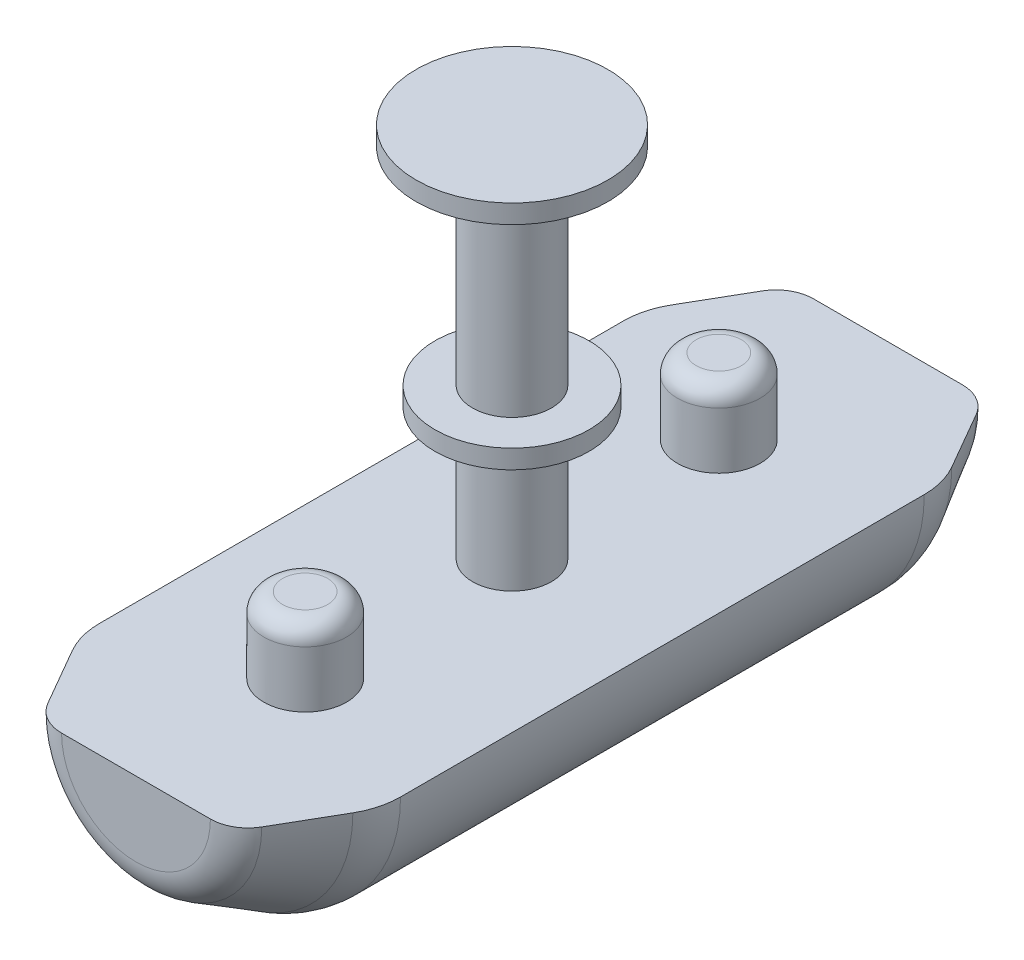
ISO-10303-21;
HEADER;
FILE_DESCRIPTION(('STEP AP214'),'2;1');
FILE_NAME('part.step','',(''),(''),'','','');
FILE_SCHEMA(('AUTOMOTIVE_DESIGN { 1 0 10303 214 1 1 1 1 }'));
ENDSEC;
DATA;
#1=APPLICATION_CONTEXT('core data for automotive mechanical design processes');
#2=APPLICATION_PROTOCOL_DEFINITION('international standard','automotive_design',2000,#1);
#3=PRODUCT_CONTEXT('',#1,'mechanical');
#4=PRODUCT('Part','Part','',(#3));
#5=PRODUCT_RELATED_PRODUCT_CATEGORY('part','',(#4));
#6=PRODUCT_DEFINITION_FORMATION('','',#4);
#7=PRODUCT_DEFINITION_CONTEXT('part definition',#1,'design');
#8=PRODUCT_DEFINITION('design','',#6,#7);
#9=PRODUCT_DEFINITION_SHAPE('','',#8);
#10=(LENGTH_UNIT() NAMED_UNIT(*) SI_UNIT(.MILLI.,.METRE.));
#11=(NAMED_UNIT(*) PLANE_ANGLE_UNIT() SI_UNIT($,.RADIAN.));
#12=(NAMED_UNIT(*) SI_UNIT($,.STERADIAN.) SOLID_ANGLE_UNIT());
#13=UNCERTAINTY_MEASURE_WITH_UNIT(LENGTH_MEASURE(1.E-05),#10,'distance_accuracy_value','');
#14=(GEOMETRIC_REPRESENTATION_CONTEXT(3) GLOBAL_UNCERTAINTY_ASSIGNED_CONTEXT((#13)) GLOBAL_UNIT_ASSIGNED_CONTEXT((#10,
#11,#12)) REPRESENTATION_CONTEXT('',''));
#15=CARTESIAN_POINT('',(0.,0.,0.));
#16=DIRECTION('',(0.,0.,1.));
#17=DIRECTION('',(1.,0.,0.));
#18=AXIS2_PLACEMENT_3D('',#15,#16,#17);
#19=CARTESIAN_POINT('',(0.,0.,15.));
#20=DIRECTION('',(0.,-1.,0.));
#21=DIRECTION('',(0.,0.,-1.));
#22=AXIS2_PLACEMENT_3D('',#19,#20,#21);
#23=PLANE('',#22);
#24=CARTESIAN_POINT('',(0.,0.,-11.));
#25=DIRECTION('',(0.,-1.,0.));
#26=DIRECTION('',(0.,0.,-1.));
#27=AXIS2_PLACEMENT_3D('',#24,#25,#26);
#28=CIRCLE('',#27,2.2);
#29=CARTESIAN_POINT('',(0.,0.,-13.2));
#30=VERTEX_POINT('',#29);
#31=EDGE_CURVE('E162',#30,#30,#28,.F.);
#32=ORIENTED_EDGE('',*,*,#31,.F.);
#33=EDGE_LOOP('',(#32));
#34=FACE_BOUND('',#33,.T.);
#35=CARTESIAN_POINT('',(0.,0.,11.));
#36=DIRECTION('',(0.,-1.,0.));
#37=DIRECTION('',(0.,0.,-1.));
#38=AXIS2_PLACEMENT_3D('',#35,#36,#37);
#39=CIRCLE('',#38,2.2);
#40=CARTESIAN_POINT('',(0.,0.,8.8));
#41=VERTEX_POINT('',#40);
#42=EDGE_CURVE('E159',#41,#41,#39,.F.);
#43=ORIENTED_EDGE('',*,*,#42,.F.);
#44=EDGE_LOOP('',(#43));
#45=FACE_BOUND('',#44,.T.);
#46=DIRECTION('',(1.,0.,0.));
#47=VECTOR('',#46,1.);
#48=CARTESIAN_POINT('',(0.,0.,20.));
#49=LINE('',#48,#47);
#50=CARTESIAN_POINT('',(-3.95854811567259,0.,20.));
#51=VERTEX_POINT('',#50);
#52=CARTESIAN_POINT('',(3.95854811567259,0.,20.));
#53=VERTEX_POINT('',#52);
#54=EDGE_CURVE('E222',#51,#53,#49,.T.);
#55=ORIENTED_EDGE('',*,*,#54,.T.);
#56=CARTESIAN_POINT('',(3.95854811567259,0.,18.));
#57=DIRECTION('',(0.,-1.,0.));
#58=DIRECTION('',(0.,0.,-1.));
#59=AXIS2_PLACEMENT_3D('',#56,#57,#58);
#60=CIRCLE('',#59,2.);
#61=CARTESIAN_POINT('',(5.69059892324146,0.,19.));
#62=VERTEX_POINT('',#61);
#63=EDGE_CURVE('E64',#53,#62,#60,.F.);
#64=ORIENTED_EDGE('',*,*,#63,.T.);
#65=DIRECTION('',(-0.500000000000004,0.,0.866025403784436));
#66=VECTOR('',#65,1.);
#67=CARTESIAN_POINT('',(5.11324865405184,0.,20.));
#68=LINE('',#67,#66);
#69=CARTESIAN_POINT('',(7.46410161513774,0.,15.9282032302755));
#70=VERTEX_POINT('',#69);
#71=EDGE_CURVE('E229',#70,#62,#68,.T.);
#72=ORIENTED_EDGE('',*,*,#71,.F.);
#73=CARTESIAN_POINT('',(4.,0.,13.9282032302755));
#74=DIRECTION('',(0.,-1.,0.));
#75=DIRECTION('',(0.,0.,-1.));
#76=AXIS2_PLACEMENT_3D('',#73,#74,#75);
#77=CIRCLE('',#76,4.);
#78=CARTESIAN_POINT('',(8.,0.,13.9282032302755));
#79=VERTEX_POINT('',#78);
#80=EDGE_CURVE('E111',#70,#79,#77,.F.);
#81=ORIENTED_EDGE('',*,*,#80,.T.);
#82=DIRECTION('',(0.,0.,-1.));
#83=VECTOR('',#82,1.);
#84=CARTESIAN_POINT('',(8.,0.,15.));
#85=LINE('',#84,#83);
#86=CARTESIAN_POINT('',(8.,0.,-13.9282032302755));
#87=VERTEX_POINT('',#86);
#88=EDGE_CURVE('E106',#79,#87,#85,.T.);
#89=ORIENTED_EDGE('',*,*,#88,.T.);
#90=CARTESIAN_POINT('',(4.,0.,-13.9282032302755));
#91=DIRECTION('',(0.,-1.,0.));
#92=DIRECTION('',(0.,0.,-1.));
#93=AXIS2_PLACEMENT_3D('',#90,#91,#92);
#94=CIRCLE('',#93,4.);
#95=CARTESIAN_POINT('',(7.46410161513774,0.,-15.9282032302755));
#96=VERTEX_POINT('',#95);
#97=EDGE_CURVE('E109',#87,#96,#94,.F.);
#98=ORIENTED_EDGE('',*,*,#97,.T.);
#99=DIRECTION('',(-0.500000000000004,0.,-0.866025403784436));
#100=VECTOR('',#99,1.);
#101=CARTESIAN_POINT('',(5.11324865405184,0.,-20.));
#102=LINE('',#101,#100);
#103=CARTESIAN_POINT('',(5.69059892324146,0.,-19.));
#104=VERTEX_POINT('',#103);
#105=EDGE_CURVE('E225',#96,#104,#102,.T.);
#106=ORIENTED_EDGE('',*,*,#105,.T.);
#107=CARTESIAN_POINT('',(3.95854811567259,0.,-18.));
#108=DIRECTION('',(0.,-1.,0.));
#109=DIRECTION('',(0.,0.,-1.));
#110=AXIS2_PLACEMENT_3D('',#107,#108,#109);
#111=CIRCLE('',#110,2.);
#112=CARTESIAN_POINT('',(3.95854811567259,0.,-20.));
#113=VERTEX_POINT('',#112);
#114=EDGE_CURVE('E140',#104,#113,#111,.F.);
#115=ORIENTED_EDGE('',*,*,#114,.T.);
#116=DIRECTION('',(1.,0.,0.));
#117=VECTOR('',#116,1.);
#118=CARTESIAN_POINT('',(0.,0.,-20.));
#119=LINE('',#118,#117);
#120=CARTESIAN_POINT('',(-3.95854811567259,0.,-20.));
#121=VERTEX_POINT('',#120);
#122=EDGE_CURVE('E116',#121,#113,#119,.T.);
#123=ORIENTED_EDGE('',*,*,#122,.F.);
#124=CARTESIAN_POINT('',(-3.95854811567259,0.,-18.));
#125=DIRECTION('',(0.,-1.,0.));
#126=DIRECTION('',(0.,0.,-1.));
#127=AXIS2_PLACEMENT_3D('',#124,#125,#126);
#128=CIRCLE('',#127,2.);
#129=CARTESIAN_POINT('',(-5.69059892324146,0.,-19.));
#130=VERTEX_POINT('',#129);
#131=EDGE_CURVE('E138',#121,#130,#128,.F.);
#132=ORIENTED_EDGE('',*,*,#131,.T.);
#133=DIRECTION('',(0.500000000000004,0.,-0.866025403784436));
#134=VECTOR('',#133,1.);
#135=CARTESIAN_POINT('',(-5.11324865405184,0.,-20.));
#136=LINE('',#135,#134);
#137=CARTESIAN_POINT('',(-7.46410161513774,0.,-15.9282032302755));
#138=VERTEX_POINT('',#137);
#139=EDGE_CURVE('E227',#138,#130,#136,.T.);
#140=ORIENTED_EDGE('',*,*,#139,.F.);
#141=CARTESIAN_POINT('',(-4.,0.,-13.9282032302755));
#142=DIRECTION('',(0.,-1.,0.));
#143=DIRECTION('',(0.,0.,-1.));
#144=AXIS2_PLACEMENT_3D('',#141,#142,#143);
#145=CIRCLE('',#144,4.);
#146=CARTESIAN_POINT('',(-8.,0.,-13.9282032302755));
#147=VERTEX_POINT('',#146);
#148=EDGE_CURVE('E125',#138,#147,#145,.F.);
#149=ORIENTED_EDGE('',*,*,#148,.T.);
#150=DIRECTION('',(0.,0.,-1.));
#151=VECTOR('',#150,1.);
#152=CARTESIAN_POINT('',(-8.,0.,15.));
#153=LINE('',#152,#151);
#154=CARTESIAN_POINT('',(-8.,0.,13.9282032302755));
#155=VERTEX_POINT('',#154);
#156=EDGE_CURVE('E115',#155,#147,#153,.T.);
#157=ORIENTED_EDGE('',*,*,#156,.F.);
#158=CARTESIAN_POINT('',(-4.,0.,13.9282032302755));
#159=DIRECTION('',(0.,-1.,0.));
#160=DIRECTION('',(0.,0.,-1.));
#161=AXIS2_PLACEMENT_3D('',#158,#159,#160);
#162=CIRCLE('',#161,4.);
#163=CARTESIAN_POINT('',(-7.46410161513774,0.,15.9282032302755));
#164=VERTEX_POINT('',#163);
#165=EDGE_CURVE('E147',#155,#164,#162,.F.);
#166=ORIENTED_EDGE('',*,*,#165,.T.);
#167=DIRECTION('',(0.500000000000004,0.,0.866025403784436));
#168=VECTOR('',#167,1.);
#169=CARTESIAN_POINT('',(-5.11324865405184,0.,20.));
#170=LINE('',#169,#168);
#171=CARTESIAN_POINT('',(-5.69059892324146,0.,19.));
#172=VERTEX_POINT('',#171);
#173=EDGE_CURVE('E223',#164,#172,#170,.T.);
#174=ORIENTED_EDGE('',*,*,#173,.T.);
#175=CARTESIAN_POINT('',(-3.95854811567259,0.,18.));
#176=DIRECTION('',(0.,-1.,0.));
#177=DIRECTION('',(0.,0.,-1.));
#178=AXIS2_PLACEMENT_3D('',#175,#176,#177);
#179=CIRCLE('',#178,2.);
#180=EDGE_CURVE('E155',#172,#51,#179,.F.);
#181=ORIENTED_EDGE('',*,*,#180,.T.);
#182=EDGE_LOOP('',(#55,#64,#72,#81,#89,#98,#106,#115,#123,#132,#140,#149,#157,#166,#174,#181));
#183=FACE_BOUND('',#182,.T.);
#184=ADVANCED_FACE('F41',(#34,#45,#183),#23,.F.);
#185=CARTESIAN_POINT('',(0.,0.,15.));
#186=DIRECTION('',(0.,0.,-1.));
#187=DIRECTION('',(-1.,0.,0.));
#188=AXIS2_PLACEMENT_3D('',#185,#186,#187);
#189=CYLINDRICAL_SURFACE('',#188,8.);
#190=ORIENTED_EDGE('',*,*,#88,.F.);
#191=CARTESIAN_POINT('',(0.,0.,13.9282032302755));
#192=DIRECTION('',(0.,0.,-1.));
#193=DIRECTION('',(-1.,0.,0.));
#194=AXIS2_PLACEMENT_3D('',#191,#192,#193);
#195=CIRCLE('',#194,8.);
#196=EDGE_CURVE('E150',#79,#155,#195,.T.);
#197=ORIENTED_EDGE('',*,*,#196,.T.);
#198=ORIENTED_EDGE('',*,*,#156,.T.);
#199=CARTESIAN_POINT('',(0.,0.,-13.9282032302755));
#200=DIRECTION('',(0.,0.,-1.));
#201=DIRECTION('',(-1.,0.,0.));
#202=AXIS2_PLACEMENT_3D('',#199,#200,#201);
#203=CIRCLE('',#202,8.);
#204=EDGE_CURVE('E123',#147,#87,#203,.F.);
#205=ORIENTED_EDGE('',*,*,#204,.T.);
#206=EDGE_LOOP('',(#190,#197,#198,#205));
#207=FACE_BOUND('',#206,.T.);
#208=ADVANCED_FACE('F127',(#207),#189,.T.);
#209=CARTESIAN_POINT('',(0.,0.,-20.));
#210=DIRECTION('',(0.,0.,-1.));
#211=DIRECTION('',(-1.,0.,0.));
#212=AXIS2_PLACEMENT_3D('',#209,#210,#211);
#213=PLANE('',#212);
#214=ORIENTED_EDGE('',*,*,#122,.T.);
#215=CARTESIAN_POINT('',(0.,0.,-20.));
#216=DIRECTION('',(0.,0.,-1.));
#217=DIRECTION('',(-1.,0.,0.));
#218=AXIS2_PLACEMENT_3D('',#215,#216,#217);
#219=CIRCLE('',#218,3.95854811567259);
#220=EDGE_CURVE('E142',#113,#121,#219,.T.);
#221=ORIENTED_EDGE('',*,*,#220,.T.);
#222=EDGE_LOOP('',(#214,#221));
#223=FACE_BOUND('',#222,.T.);
#224=ADVANCED_FACE('F192',(#223),#213,.T.);
#225=CARTESIAN_POINT('',(0.,0.,-15.));
#226=DIRECTION('',(0.,0.,1.));
#227=DIRECTION('',(1.,0.,0.));
#228=AXIS2_PLACEMENT_3D('',#225,#226,#227);
#229=CONICAL_SURFACE('',#228,8.,0.523598775598304);
#230=ORIENTED_EDGE('',*,*,#139,.T.);
#231=CARTESIAN_POINT('',(0.,0.,-19.));
#232=DIRECTION('',(0.,0.,-1.));
#233=DIRECTION('',(-1.,0.,0.));
#234=AXIS2_PLACEMENT_3D('',#231,#232,#233);
#235=CIRCLE('',#234,5.69059892324146);
#236=EDGE_CURVE('E135',#130,#104,#235,.F.);
#237=ORIENTED_EDGE('',*,*,#236,.T.);
#238=ORIENTED_EDGE('',*,*,#105,.F.);
#239=CARTESIAN_POINT('',(0.,0.,-15.9282032302755));
#240=DIRECTION('',(0.,0.,1.));
#241=DIRECTION('',(1.,0.,0.));
#242=AXIS2_PLACEMENT_3D('',#239,#240,#241);
#243=CIRCLE('',#242,7.46410161513774);
#244=EDGE_CURVE('E124',#96,#138,#243,.F.);
#245=ORIENTED_EDGE('',*,*,#244,.T.);
#246=EDGE_LOOP('',(#230,#237,#238,#245));
#247=FACE_BOUND('',#246,.T.);
#248=ADVANCED_FACE('F201',(#247),#229,.T.);
#249=CARTESIAN_POINT('',(0.,0.,-13.9282032302755));
#250=DIRECTION('',(0.,0.,-1.));
#251=DIRECTION('',(-1.,0.,0.));
#252=AXIS2_PLACEMENT_3D('',#249,#250,#251);
#253=DEGENERATE_TOROIDAL_SURFACE('',#252,4.,4.,.T.);
#254=ORIENTED_EDGE('',*,*,#148,.F.);
#255=ORIENTED_EDGE('',*,*,#244,.F.);
#256=ORIENTED_EDGE('',*,*,#97,.F.);
#257=ORIENTED_EDGE('',*,*,#204,.F.);
#258=EDGE_LOOP('',(#254,#255,#256,#257));
#259=FACE_BOUND('',#258,.T.);
#260=ADVANCED_FACE('F122',(#259),#253,.T.);
#261=CARTESIAN_POINT('',(0.,0.,-18.));
#262=DIRECTION('',(0.,0.,-1.));
#263=DIRECTION('',(-1.,0.,0.));
#264=AXIS2_PLACEMENT_3D('',#261,#262,#263);
#265=TOROIDAL_SURFACE('',#264,3.95854811567259,2.);
#266=ORIENTED_EDGE('',*,*,#131,.F.);
#267=ORIENTED_EDGE('',*,*,#220,.F.);
#268=ORIENTED_EDGE('',*,*,#114,.F.);
#269=ORIENTED_EDGE('',*,*,#236,.F.);
#270=EDGE_LOOP('',(#266,#267,#268,#269));
#271=FACE_BOUND('',#270,.T.);
#272=ADVANCED_FACE('F200',(#271),#265,.T.);
#273=CARTESIAN_POINT('',(0.,0.,20.));
#274=DIRECTION('',(0.,0.,1.));
#275=DIRECTION('',(-1.,0.,0.));
#276=AXIS2_PLACEMENT_3D('',#273,#274,#275);
#277=PLANE('',#276);
#278=ORIENTED_EDGE('',*,*,#54,.F.);
#279=CARTESIAN_POINT('',(0.,0.,20.));
#280=DIRECTION('',(0.,0.,1.));
#281=DIRECTION('',(1.,0.,0.));
#282=AXIS2_PLACEMENT_3D('',#279,#280,#281);
#283=CIRCLE('',#282,3.95854811567259);
#284=EDGE_CURVE('E152',#51,#53,#283,.T.);
#285=ORIENTED_EDGE('',*,*,#284,.T.);
#286=EDGE_LOOP('',(#278,#285));
#287=FACE_BOUND('',#286,.T.);
#288=ADVANCED_FACE('F204',(#287),#277,.T.);
#289=CARTESIAN_POINT('',(0.,0.,15.));
#290=DIRECTION('',(0.,0.,-1.));
#291=DIRECTION('',(1.,0.,0.));
#292=AXIS2_PLACEMENT_3D('',#289,#290,#291);
#293=CONICAL_SURFACE('',#292,8.,0.523598775598304);
#294=ORIENTED_EDGE('',*,*,#71,.T.);
#295=CARTESIAN_POINT('',(0.,0.,19.));
#296=DIRECTION('',(0.,0.,1.));
#297=DIRECTION('',(1.,0.,0.));
#298=AXIS2_PLACEMENT_3D('',#295,#296,#297);
#299=CIRCLE('',#298,5.69059892324146);
#300=EDGE_CURVE('E56',#62,#172,#299,.F.);
#301=ORIENTED_EDGE('',*,*,#300,.T.);
#302=ORIENTED_EDGE('',*,*,#173,.F.);
#303=CARTESIAN_POINT('',(0.,0.,15.9282032302755));
#304=DIRECTION('',(0.,0.,-1.));
#305=DIRECTION('',(-1.,0.,0.));
#306=AXIS2_PLACEMENT_3D('',#303,#304,#305);
#307=CIRCLE('',#306,7.46410161513774);
#308=EDGE_CURVE('E144',#164,#70,#307,.F.);
#309=ORIENTED_EDGE('',*,*,#308,.T.);
#310=EDGE_LOOP('',(#294,#301,#302,#309));
#311=FACE_BOUND('',#310,.T.);
#312=ADVANCED_FACE('F210',(#311),#293,.T.);
#313=CARTESIAN_POINT('',(0.,0.,13.9282032302755));
#314=DIRECTION('',(0.,0.,-1.));
#315=DIRECTION('',(-1.,0.,0.));
#316=AXIS2_PLACEMENT_3D('',#313,#314,#315);
#317=DEGENERATE_TOROIDAL_SURFACE('',#316,4.,4.,.T.);
#318=ORIENTED_EDGE('',*,*,#165,.F.);
#319=ORIENTED_EDGE('',*,*,#196,.F.);
#320=ORIENTED_EDGE('',*,*,#80,.F.);
#321=ORIENTED_EDGE('',*,*,#308,.F.);
#322=EDGE_LOOP('',(#318,#319,#320,#321));
#323=FACE_BOUND('',#322,.T.);
#324=ADVANCED_FACE('F206',(#323),#317,.T.);
#325=CARTESIAN_POINT('',(0.,0.,18.));
#326=DIRECTION('',(0.,0.,1.));
#327=DIRECTION('',(1.,0.,0.));
#328=AXIS2_PLACEMENT_3D('',#325,#326,#327);
#329=TOROIDAL_SURFACE('',#328,3.95854811567259,2.);
#330=ORIENTED_EDGE('',*,*,#180,.F.);
#331=ORIENTED_EDGE('',*,*,#300,.F.);
#332=ORIENTED_EDGE('',*,*,#63,.F.);
#333=ORIENTED_EDGE('',*,*,#284,.F.);
#334=EDGE_LOOP('',(#330,#331,#332,#333));
#335=FACE_BOUND('',#334,.T.);
#336=ADVANCED_FACE('F209',(#335),#329,.T.);
#337=CARTESIAN_POINT('',(0.,4.,11.));
#338=DIRECTION('',(0.,-1.,0.));
#339=DIRECTION('',(0.,0.,-1.));
#340=AXIS2_PLACEMENT_3D('',#337,#338,#339);
#341=CYLINDRICAL_SURFACE('',#340,2.2);
#342=CARTESIAN_POINT('',(0.,3.,11.));
#343=DIRECTION('',(0.,1.,0.));
#344=DIRECTION('',(0.,0.,1.));
#345=AXIS2_PLACEMENT_3D('',#342,#343,#344);
#346=CIRCLE('',#345,2.2);
#347=CARTESIAN_POINT('',(0.,3.,13.2));
#348=VERTEX_POINT('',#347);
#349=EDGE_CURVE('E12',#348,#348,#346,.F.);
#350=ORIENTED_EDGE('',*,*,#349,.T.);
#351=EDGE_LOOP('',(#350));
#352=FACE_BOUND('',#351,.T.);
#353=ORIENTED_EDGE('',*,*,#42,.T.);
#354=EDGE_LOOP('',(#353));
#355=FACE_BOUND('',#354,.T.);
#356=ADVANCED_FACE('F213',(#352,#355),#341,.T.);
#357=CARTESIAN_POINT('',(0.,4.,11.));
#358=DIRECTION('',(0.,1.,0.));
#359=DIRECTION('',(0.,0.,1.));
#360=AXIS2_PLACEMENT_3D('',#357,#358,#359);
#361=PLANE('',#360);
#362=CARTESIAN_POINT('',(0.,4.,11.));
#363=DIRECTION('',(0.,1.,0.));
#364=DIRECTION('',(0.,0.,1.));
#365=AXIS2_PLACEMENT_3D('',#362,#363,#364);
#366=CIRCLE('',#365,1.2);
#367=CARTESIAN_POINT('',(0.,4.,12.2));
#368=VERTEX_POINT('',#367);
#369=EDGE_CURVE('E49',#368,#368,#366,.T.);
#370=ORIENTED_EDGE('',*,*,#369,.T.);
#371=EDGE_LOOP('',(#370));
#372=FACE_BOUND('',#371,.T.);
#373=ADVANCED_FACE('F173',(#372),#361,.T.);
#374=CARTESIAN_POINT('',(0.,4.,-11.));
#375=DIRECTION('',(0.,-1.,0.));
#376=DIRECTION('',(0.,0.,-1.));
#377=AXIS2_PLACEMENT_3D('',#374,#375,#376);
#378=CYLINDRICAL_SURFACE('',#377,2.2);
#379=CARTESIAN_POINT('',(0.,3.,-11.));
#380=DIRECTION('',(0.,1.,0.));
#381=DIRECTION('',(0.,0.,1.));
#382=AXIS2_PLACEMENT_3D('',#379,#380,#381);
#383=CIRCLE('',#382,2.2);
#384=CARTESIAN_POINT('',(0.,3.,-8.8));
#385=VERTEX_POINT('',#384);
#386=EDGE_CURVE('E168',#385,#385,#383,.F.);
#387=ORIENTED_EDGE('',*,*,#386,.T.);
#388=EDGE_LOOP('',(#387));
#389=FACE_BOUND('',#388,.T.);
#390=ORIENTED_EDGE('',*,*,#31,.T.);
#391=EDGE_LOOP('',(#390));
#392=FACE_BOUND('',#391,.T.);
#393=ADVANCED_FACE('F255',(#389,#392),#378,.T.);
#394=CARTESIAN_POINT('',(0.,4.,-11.));
#395=DIRECTION('',(0.,1.,0.));
#396=DIRECTION('',(0.,0.,1.));
#397=AXIS2_PLACEMENT_3D('',#394,#395,#396);
#398=PLANE('',#397);
#399=CARTESIAN_POINT('',(0.,4.,-11.));
#400=DIRECTION('',(0.,1.,0.));
#401=DIRECTION('',(0.,0.,1.));
#402=AXIS2_PLACEMENT_3D('',#399,#400,#401);
#403=CIRCLE('',#402,1.2);
#404=CARTESIAN_POINT('',(0.,4.,-9.8));
#405=VERTEX_POINT('',#404);
#406=EDGE_CURVE('E165',#405,#405,#403,.T.);
#407=ORIENTED_EDGE('',*,*,#406,.T.);
#408=EDGE_LOOP('',(#407));
#409=FACE_BOUND('',#408,.T.);
#410=ADVANCED_FACE('F181',(#409),#398,.T.);
#411=CARTESIAN_POINT('',(0.,3.,-11.));
#412=DIRECTION('',(0.,1.,0.));
#413=DIRECTION('',(0.,0.,1.));
#414=AXIS2_PLACEMENT_3D('',#411,#412,#413);
#415=TOROIDAL_SURFACE('',#414,1.2,1.);
#416=ORIENTED_EDGE('',*,*,#386,.F.);
#417=EDGE_LOOP('',(#416));
#418=FACE_BOUND('',#417,.T.);
#419=ORIENTED_EDGE('',*,*,#406,.F.);
#420=EDGE_LOOP('',(#419));
#421=FACE_BOUND('',#420,.T.);
#422=ADVANCED_FACE('F176',(#418,#421),#415,.T.);
#423=CARTESIAN_POINT('',(0.,3.,11.));
#424=DIRECTION('',(0.,1.,0.));
#425=DIRECTION('',(0.,0.,1.));
#426=AXIS2_PLACEMENT_3D('',#423,#424,#425);
#427=TOROIDAL_SURFACE('',#426,1.2,1.);
#428=ORIENTED_EDGE('',*,*,#349,.F.);
#429=EDGE_LOOP('',(#428));
#430=FACE_BOUND('',#429,.T.);
#431=ORIENTED_EDGE('',*,*,#369,.F.);
#432=EDGE_LOOP('',(#431));
#433=FACE_BOUND('',#432,.T.);
#434=ADVANCED_FACE('F43',(#430,#433),#427,.T.);
#435=CLOSED_SHELL('',(#184,#208,#224,#248,#260,#272,#288,#312,#324,#336,#356,#373,#393,#410,
#422,#434));
#436=MANIFOLD_SOLID_BREP('B2',#435);
#437=CARTESIAN_POINT('',(0.,7.,0.));
#438=DIRECTION('',(0.,-1.,0.));
#439=DIRECTION('',(0.,0.,-1.));
#440=AXIS2_PLACEMENT_3D('',#437,#438,#439);
#441=CYLINDRICAL_SURFACE('',#440,2.1);
#442=CARTESIAN_POINT('',(0.,7.,0.));
#443=DIRECTION('',(0.,1.,0.));
#444=DIRECTION('',(0.,0.,1.));
#445=AXIS2_PLACEMENT_3D('',#442,#443,#444);
#446=CIRCLE('',#445,2.1);
#447=CARTESIAN_POINT('',(0.,7.,2.1));
#448=VERTEX_POINT('',#447);
#449=EDGE_CURVE('E40',#448,#448,#446,.T.);
#450=ORIENTED_EDGE('',*,*,#449,.F.);
#451=EDGE_LOOP('',(#450));
#452=FACE_BOUND('',#451,.T.);
#453=CARTESIAN_POINT('',(0.,0.,0.));
#454=DIRECTION('',(0.,1.,0.));
#455=DIRECTION('',(0.,0.,1.));
#456=AXIS2_PLACEMENT_3D('',#453,#454,#455);
#457=CIRCLE('',#456,2.1);
#458=CARTESIAN_POINT('',(0.,0.,2.1));
#459=VERTEX_POINT('',#458);
#460=EDGE_CURVE('E376',#459,#459,#457,.T.);
#461=ORIENTED_EDGE('',*,*,#460,.T.);
#462=EDGE_LOOP('',(#461));
#463=FACE_BOUND('',#462,.T.);
#464=ADVANCED_FACE('F373',(#452,#463),#441,.T.);
#465=CARTESIAN_POINT('',(0.,0.,0.));
#466=DIRECTION('',(0.,1.,0.));
#467=DIRECTION('',(0.,0.,1.));
#468=AXIS2_PLACEMENT_3D('',#465,#466,#467);
#469=PLANE('',#468);
#470=ORIENTED_EDGE('',*,*,#460,.F.);
#471=EDGE_LOOP('',(#470));
#472=FACE_BOUND('',#471,.T.);
#473=ADVANCED_FACE('F421',(#472),#469,.F.);
#474=CARTESIAN_POINT('',(0.,8.,0.));
#475=DIRECTION('',(0.,-1.,0.));
#476=DIRECTION('',(0.,0.,-1.));
#477=AXIS2_PLACEMENT_3D('',#474,#475,#476);
#478=CYLINDRICAL_SURFACE('',#477,4.1);
#479=CARTESIAN_POINT('',(0.,8.,0.));
#480=DIRECTION('',(0.,1.,0.));
#481=DIRECTION('',(0.,0.,1.));
#482=AXIS2_PLACEMENT_3D('',#479,#480,#481);
#483=CIRCLE('',#482,4.1);
#484=CARTESIAN_POINT('',(0.,8.,4.1));
#485=VERTEX_POINT('',#484);
#486=EDGE_CURVE('E383',#485,#485,#483,.T.);
#487=ORIENTED_EDGE('',*,*,#486,.F.);
#488=EDGE_LOOP('',(#487));
#489=FACE_BOUND('',#488,.T.);
#490=CARTESIAN_POINT('',(0.,7.,0.));
#491=DIRECTION('',(0.,1.,0.));
#492=DIRECTION('',(0.,0.,1.));
#493=AXIS2_PLACEMENT_3D('',#490,#491,#492);
#494=CIRCLE('',#493,4.1);
#495=CARTESIAN_POINT('',(0.,7.,4.1));
#496=VERTEX_POINT('',#495);
#497=EDGE_CURVE('E385',#496,#496,#494,.T.);
#498=ORIENTED_EDGE('',*,*,#497,.T.);
#499=EDGE_LOOP('',(#498));
#500=FACE_BOUND('',#499,.T.);
#501=ADVANCED_FACE('F426',(#489,#500),#478,.T.);
#502=CARTESIAN_POINT('',(0.,8.,0.));
#503=DIRECTION('',(0.,1.,0.));
#504=DIRECTION('',(0.,0.,1.));
#505=AXIS2_PLACEMENT_3D('',#502,#503,#504);
#506=PLANE('',#505);
#507=CARTESIAN_POINT('',(0.,8.,0.));
#508=DIRECTION('',(0.,1.,0.));
#509=DIRECTION('',(0.,0.,1.));
#510=AXIS2_PLACEMENT_3D('',#507,#508,#509);
#511=CIRCLE('',#510,2.1);
#512=CARTESIAN_POINT('',(0.,8.,2.1));
#513=VERTEX_POINT('',#512);
#514=EDGE_CURVE('E391',#513,#513,#511,.T.);
#515=ORIENTED_EDGE('',*,*,#514,.F.);
#516=EDGE_LOOP('',(#515));
#517=FACE_BOUND('',#516,.T.);
#518=ORIENTED_EDGE('',*,*,#486,.T.);
#519=EDGE_LOOP('',(#518));
#520=FACE_BOUND('',#519,.T.);
#521=ADVANCED_FACE('F433',(#517,#520),#506,.T.);
#522=CARTESIAN_POINT('',(0.,7.,0.));
#523=DIRECTION('',(0.,1.,0.));
#524=DIRECTION('',(0.,0.,1.));
#525=AXIS2_PLACEMENT_3D('',#522,#523,#524);
#526=PLANE('',#525);
#527=ORIENTED_EDGE('',*,*,#449,.T.);
#528=EDGE_LOOP('',(#527));
#529=FACE_BOUND('',#528,.T.);
#530=ORIENTED_EDGE('',*,*,#497,.F.);
#531=EDGE_LOOP('',(#530));
#532=FACE_BOUND('',#531,.T.);
#533=ADVANCED_FACE('F437',(#529,#532),#526,.F.);
#534=CARTESIAN_POINT('',(0.,19.,0.));
#535=DIRECTION('',(0.,-1.,0.));
#536=DIRECTION('',(0.,0.,-1.));
#537=AXIS2_PLACEMENT_3D('',#534,#535,#536);
#538=CYLINDRICAL_SURFACE('',#537,2.1);
#539=CARTESIAN_POINT('',(0.,19.,0.));
#540=DIRECTION('',(0.,1.,0.));
#541=DIRECTION('',(0.,0.,1.));
#542=AXIS2_PLACEMENT_3D('',#539,#540,#541);
#543=CIRCLE('',#542,2.1);
#544=CARTESIAN_POINT('',(0.,19.,2.1));
#545=VERTEX_POINT('',#544);
#546=EDGE_CURVE('E388',#545,#545,#543,.T.);
#547=ORIENTED_EDGE('',*,*,#546,.F.);
#548=EDGE_LOOP('',(#547));
#549=FACE_BOUND('',#548,.T.);
#550=ORIENTED_EDGE('',*,*,#514,.T.);
#551=EDGE_LOOP('',(#550));
#552=FACE_BOUND('',#551,.T.);
#553=ADVANCED_FACE('F408',(#549,#552),#538,.T.);
#554=CARTESIAN_POINT('',(0.,20.,0.));
#555=DIRECTION('',(0.,-1.,0.));
#556=DIRECTION('',(0.,0.,-1.));
#557=AXIS2_PLACEMENT_3D('',#554,#555,#556);
#558=CYLINDRICAL_SURFACE('',#557,5.1);
#559=CARTESIAN_POINT('',(0.,20.,0.));
#560=DIRECTION('',(0.,1.,0.));
#561=DIRECTION('',(0.,0.,1.));
#562=AXIS2_PLACEMENT_3D('',#559,#560,#561);
#563=CIRCLE('',#562,5.1);
#564=CARTESIAN_POINT('',(0.,20.,5.1));
#565=VERTEX_POINT('',#564);
#566=EDGE_CURVE('E394',#565,#565,#563,.T.);
#567=ORIENTED_EDGE('',*,*,#566,.F.);
#568=EDGE_LOOP('',(#567));
#569=FACE_BOUND('',#568,.T.);
#570=CARTESIAN_POINT('',(0.,19.,0.));
#571=DIRECTION('',(0.,1.,0.));
#572=DIRECTION('',(0.,0.,1.));
#573=AXIS2_PLACEMENT_3D('',#570,#571,#572);
#574=CIRCLE('',#573,5.1);
#575=CARTESIAN_POINT('',(0.,19.,5.1));
#576=VERTEX_POINT('',#575);
#577=EDGE_CURVE('E397',#576,#576,#574,.T.);
#578=ORIENTED_EDGE('',*,*,#577,.T.);
#579=EDGE_LOOP('',(#578));
#580=FACE_BOUND('',#579,.T.);
#581=ADVANCED_FACE('F405',(#569,#580),#558,.T.);
#582=CARTESIAN_POINT('',(0.,20.,0.));
#583=DIRECTION('',(0.,1.,0.));
#584=DIRECTION('',(0.,0.,1.));
#585=AXIS2_PLACEMENT_3D('',#582,#583,#584);
#586=PLANE('',#585);
#587=ORIENTED_EDGE('',*,*,#566,.T.);
#588=EDGE_LOOP('',(#587));
#589=FACE_BOUND('',#588,.T.);
#590=ADVANCED_FACE('F403',(#589),#586,.T.);
#591=CARTESIAN_POINT('',(0.,19.,0.));
#592=DIRECTION('',(0.,1.,0.));
#593=DIRECTION('',(0.,0.,1.));
#594=AXIS2_PLACEMENT_3D('',#591,#592,#593);
#595=PLANE('',#594);
#596=ORIENTED_EDGE('',*,*,#546,.T.);
#597=EDGE_LOOP('',(#596));
#598=FACE_BOUND('',#597,.T.);
#599=ORIENTED_EDGE('',*,*,#577,.F.);
#600=EDGE_LOOP('',(#599));
#601=FACE_BOUND('',#600,.T.);
#602=ADVANCED_FACE('F412',(#598,#601),#595,.F.);
#603=CLOSED_SHELL('',(#464,#473,#501,#521,#533,#553,#581,#590,#602));
#604=MANIFOLD_SOLID_BREP('B6',#603);
#605=ADVANCED_BREP_SHAPE_REPRESENTATION('',(#18,#436,#604),#14);
#606=SHAPE_DEFINITION_REPRESENTATION(#9,#605);
ENDSEC;
END-ISO-10303-21;
